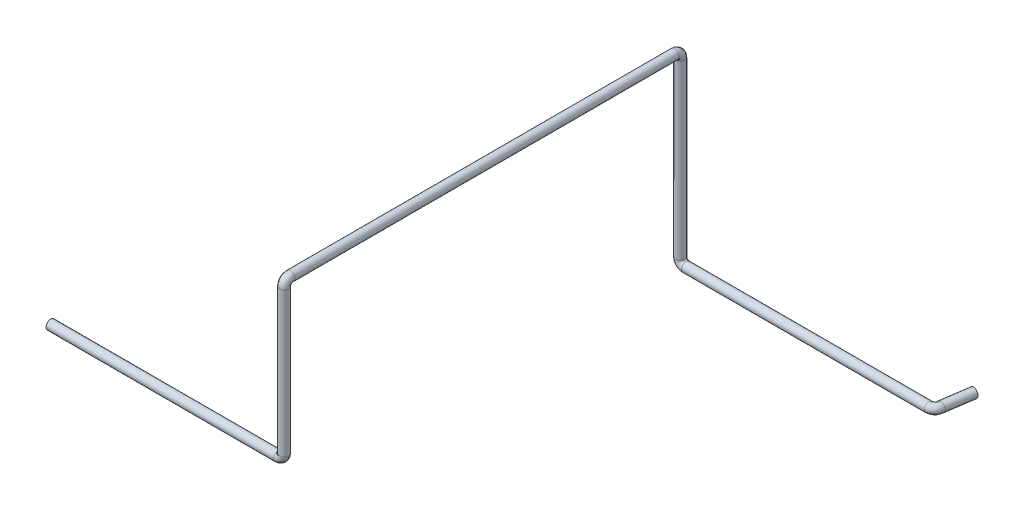
ISO-10303-21;
HEADER;
FILE_DESCRIPTION(('STEP AP214'),'2;1');
FILE_NAME('part.step','',(''),(''),'','','');
FILE_SCHEMA(('AUTOMOTIVE_DESIGN { 1 0 10303 214 1 1 1 1 }'));
ENDSEC;
DATA;
#1=APPLICATION_CONTEXT('core data for automotive mechanical design processes');
#2=APPLICATION_PROTOCOL_DEFINITION('international standard','automotive_design',2000,#1);
#3=PRODUCT_CONTEXT('',#1,'mechanical');
#4=PRODUCT('Part','Part','',(#3));
#5=PRODUCT_RELATED_PRODUCT_CATEGORY('part','',(#4));
#6=PRODUCT_DEFINITION_FORMATION('','',#4);
#7=PRODUCT_DEFINITION_CONTEXT('part definition',#1,'design');
#8=PRODUCT_DEFINITION('design','',#6,#7);
#9=PRODUCT_DEFINITION_SHAPE('','',#8);
#10=(LENGTH_UNIT() NAMED_UNIT(*) SI_UNIT(.MILLI.,.METRE.));
#11=(NAMED_UNIT(*) PLANE_ANGLE_UNIT() SI_UNIT($,.RADIAN.));
#12=(NAMED_UNIT(*) SI_UNIT($,.STERADIAN.) SOLID_ANGLE_UNIT());
#13=UNCERTAINTY_MEASURE_WITH_UNIT(LENGTH_MEASURE(1.E-05),#10,'distance_accuracy_value','');
#14=(GEOMETRIC_REPRESENTATION_CONTEXT(3) GLOBAL_UNCERTAINTY_ASSIGNED_CONTEXT((#13)) GLOBAL_UNIT_ASSIGNED_CONTEXT((#10,
#11,#12)) REPRESENTATION_CONTEXT('',''));
#15=CARTESIAN_POINT('',(0.,0.,0.));
#16=DIRECTION('',(0.,0.,1.));
#17=DIRECTION('',(1.,0.,0.));
#18=AXIS2_PLACEMENT_3D('',#15,#16,#17);
#19=CARTESIAN_POINT('',(41.0257932553289,-4.88008921079766,-67.9258668358255));
#20=DIRECTION('',(0.999999964203966,-0.00026756693960462,1.17513169097757E-12));
#21=DIRECTION('',(1.17481796432218E-12,-1.17267368564026E-12,-1.));
#22=AXIS2_PLACEMENT_3D('',#19,#20,#21);
#23=CIRCLE('',#22,0.793749999999996);
#24=DIRECTION('',(1.,0.,0.));
#25=VECTOR('',#24,1.);
#26=SURFACE_OF_LINEAR_EXTRUSION('',#23,#25);
#27=CARTESIAN_POINT('',(41.0255808740706,-5.67383918238455,-67.9258668358255));
#28=VERTEX_POINT('',#27);
#29=EDGE_CURVE('E62',#28,#28,#23,.T.);
#30=ORIENTED_EDGE('',*,*,#29,.T.);
#31=EDGE_LOOP('',(#30));
#32=FACE_BOUND('',#31,.T.);
#33=CARTESIAN_POINT('',(82.6707932553289,-4.88008921079766,-67.9258668358255));
#34=DIRECTION('',(0.999999964203966,-0.00026756693960462,1.17513169097757E-12));
#35=DIRECTION('',(1.17481796432218E-12,-1.17267368564026E-12,-1.));
#36=AXIS2_PLACEMENT_3D('',#33,#34,#35);
#37=CIRCLE('',#36,0.793749999999996);
#38=CARTESIAN_POINT('',(82.6707932553298,-4.88008921079859,-68.7196168358255));
#39=VERTEX_POINT('',#38);
#40=EDGE_CURVE('E11',#39,#39,#37,.T.);
#41=ORIENTED_EDGE('',*,*,#40,.F.);
#42=EDGE_LOOP('',(#41));
#43=FACE_BOUND('',#42,.T.);
#44=ADVANCED_FACE('F56',(#32,#43),#26,.T.);
#45=CARTESIAN_POINT('',(41.0260608222685,-3.88008924659369,-67.9258668358255));
#46=DIRECTION('',(-1.17267306976032E-12,0.,1.));
#47=DIRECTION('',(1.,0.,1.17267306976032E-12));
#48=AXIS2_PLACEMENT_3D('',#45,#46,#47);
#49=TOROIDAL_SURFACE('',#48,1.,0.793749999999996);
#50=CARTESIAN_POINT('',(40.0260608222685,-3.88008924659369,-67.9258668358267));
#51=DIRECTION('',(0.,-1.,0.));
#52=DIRECTION('',(0.,0.,-1.));
#53=AXIS2_PLACEMENT_3D('',#50,#51,#52);
#54=CIRCLE('',#53,0.793749999999996);
#55=CARTESIAN_POINT('',(39.2323108222685,-3.88008924659369,-67.9258668358276));
#56=VERTEX_POINT('',#55);
#57=EDGE_CURVE('E95',#56,#56,#54,.T.);
#58=CARTESIAN_POINT('',(41.0260608222685,-3.88008924659369,-67.9258668358255));
#59=DIRECTION('',(-1.17267306976032E-12,0.,1.));
#60=DIRECTION('',(1.,0.,1.17267306976032E-12));
#61=AXIS2_PLACEMENT_3D('',#58,#59,#60);
#62=CIRCLE('',#61,1.79375);
#63=EDGE_CURVE('',#56,#28,#62,.T.);
#64=ORIENTED_EDGE('',*,*,#57,.T.);
#65=ORIENTED_EDGE('',*,*,#29,.F.);
#66=ORIENTED_EDGE('',*,*,#63,.T.);
#67=ORIENTED_EDGE('',*,*,#63,.F.);
#68=EDGE_LOOP('',(#64,#66,#65,#67));
#69=FACE_BOUND('',#68,.T.);
#70=ADVANCED_FACE('F143',(#69),#49,.T.);
#71=CARTESIAN_POINT('',(39.03,0.,0.));
#72=DIRECTION('',(-1.,0.,0.));
#73=DIRECTION('',(0.,0.,1.));
#74=AXIS2_PLACEMENT_3D('',#71,#72,#73);
#75=CYLINDRICAL_SURFACE('',#74,0.793749999999999);
#76=CARTESIAN_POINT('',(39.03,0.,0.));
#77=DIRECTION('',(1.,0.,0.));
#78=DIRECTION('',(0.,0.,-1.));
#79=AXIS2_PLACEMENT_3D('',#76,#77,#78);
#80=CIRCLE('',#79,0.793749999999999);
#81=CARTESIAN_POINT('',(39.03,0.,-0.793749999999999));
#82=VERTEX_POINT('',#81);
#83=EDGE_CURVE('E66',#82,#82,#80,.T.);
#84=ORIENTED_EDGE('',*,*,#83,.F.);
#85=EDGE_LOOP('',(#84));
#86=FACE_BOUND('',#85,.T.);
#87=CARTESIAN_POINT('',(0.,0.,0.));
#88=DIRECTION('',(1.,0.,0.));
#89=DIRECTION('',(0.,0.,-1.));
#90=AXIS2_PLACEMENT_3D('',#87,#88,#89);
#91=CIRCLE('',#90,0.793749999999999);
#92=CARTESIAN_POINT('',(0.,0.,-0.793749999999999));
#93=VERTEX_POINT('',#92);
#94=EDGE_CURVE('E70',#93,#93,#91,.T.);
#95=ORIENTED_EDGE('',*,*,#94,.T.);
#96=EDGE_LOOP('',(#95));
#97=FACE_BOUND('',#96,.T.);
#98=ADVANCED_FACE('F147',(#86,#97),#75,.T.);
#99=CARTESIAN_POINT('',(0.,0.,0.));
#100=DIRECTION('',(1.,0.,0.));
#101=DIRECTION('',(0.,0.,-1.));
#102=AXIS2_PLACEMENT_3D('',#99,#100,#101);
#103=PLANE('',#102);
#104=ORIENTED_EDGE('',*,*,#94,.F.);
#105=EDGE_LOOP('',(#104));
#106=FACE_BOUND('',#105,.T.);
#107=ADVANCED_FACE('F153',(#106),#103,.F.);
#108=CARTESIAN_POINT('',(39.03,0.,-0.793749999999999));
#109=CARTESIAN_POINT('',(39.095279770204,0.,-0.793749999999999));
#110=CARTESIAN_POINT('',(39.2214878893359,0.0132172628994143,-0.793749999999999));
#111=CARTESIAN_POINT('',(39.4296616530544,0.0772373758963069,-0.793749999999999));
#112=CARTESIAN_POINT('',(39.6196732684097,0.183509851019233,-0.793749999999999));
#113=CARTESIAN_POINT('',(39.7735293441814,0.319747904994047,-0.793749999999999));
#114=CARTESIAN_POINT('',(39.9040212526352,0.500909275893127,-0.793749999999999));
#115=CARTESIAN_POINT('',(39.9937701763744,0.712330300778549,-0.79375));
#116=CARTESIAN_POINT('',(40.0199883978973,0.843115742960346,-0.793749999999999));
#117=CARTESIAN_POINT('',(40.026060822274,0.911327352972005,-0.793749999999999));
#118=CARTESIAN_POINT('',(39.03,1.5875,-0.793749999999999));
#119=CARTESIAN_POINT('',(39.095279770204,1.5875,-0.793749999999999));
#120=CARTESIAN_POINT('',(38.8338514776803,1.5761907982726,-0.793749999999999));
#121=CARTESIAN_POINT('',(38.7977475950457,1.53971736077892,-0.79375));
#122=CARTESIAN_POINT('',(38.6685541781513,1.47434908763942,-0.793749999999999));
#123=CARTESIAN_POINT('',(38.5539226471975,1.36242127183498,-0.793749999999999));
#124=CARTESIAN_POINT('',(38.4833703039127,1.22491108057854,-0.793749999999998));
#125=CARTESIAN_POINT('',(38.4516012684054,1.18681215509874,-0.793749999999998));
#126=CARTESIAN_POINT('',(38.4324883978973,0.913638557488902,-0.793749999999995));
#127=CARTESIAN_POINT('',(38.4385608222739,0.981850167500561,-0.793749999999995));
#128=CARTESIAN_POINT('',(39.03,1.5875,0.793749999999999));
#129=CARTESIAN_POINT('',(39.095279770204,1.5875,0.793749999999999));
#130=CARTESIAN_POINT('',(38.8338514776803,1.5761907982726,0.793749999999999));
#131=CARTESIAN_POINT('',(38.7977475950457,1.53971736077892,0.793749999999999));
#132=CARTESIAN_POINT('',(38.6685541781513,1.47434908763942,0.79375));
#133=CARTESIAN_POINT('',(38.5539226471975,1.36242127183498,0.79375));
#134=CARTESIAN_POINT('',(38.4833703039127,1.22491108057854,0.79375));
#135=CARTESIAN_POINT('',(38.4516012684054,1.18681215509874,0.793750000000001));
#136=CARTESIAN_POINT('',(38.4324883978973,0.913638557488902,0.793750000000003));
#137=CARTESIAN_POINT('',(38.4385608222739,0.981850167500561,0.793750000000003));
#138=CARTESIAN_POINT('',(39.03,0.,0.793749999999999));
#139=CARTESIAN_POINT('',(39.095279770204,0.,0.793749999999999));
#140=CARTESIAN_POINT('',(39.2214878893359,0.0132172628994142,0.793749999999999));
#141=CARTESIAN_POINT('',(39.4296616530544,0.0772373758963069,0.793749999999999));
#142=CARTESIAN_POINT('',(39.6196732684097,0.183509851019233,0.793749999999999));
#143=CARTESIAN_POINT('',(39.7735293441814,0.319747904994047,0.793749999999999));
#144=CARTESIAN_POINT('',(39.9040212526352,0.500909275893127,0.793749999999999));
#145=CARTESIAN_POINT('',(39.9937701763744,0.712330300778549,0.79375));
#146=CARTESIAN_POINT('',(40.0199883978973,0.843115742960346,0.793749999999999));
#147=CARTESIAN_POINT('',(40.026060822274,0.911327352972005,0.793749999999999));
#148=CARTESIAN_POINT('',(39.03,-1.5875,0.79375));
#149=CARTESIAN_POINT('',(39.095279770204,-1.5875,0.79375));
#150=CARTESIAN_POINT('',(39.6091243009916,-1.54975627247377,0.793749999999999));
#151=CARTESIAN_POINT('',(40.0615757110631,-1.38524260898631,0.79375));
#152=CARTESIAN_POINT('',(40.5707923586681,-1.10732938560096,0.793749999999998));
#153=CARTESIAN_POINT('',(40.9931360411654,-0.722925461846884,0.793749999999999));
#154=CARTESIAN_POINT('',(41.3246722013576,-0.223092528792273,0.793749999999999));
#155=CARTESIAN_POINT('',(41.5359390843435,0.237848446458355,0.793749999999998));
#156=CARTESIAN_POINT('',(41.6074883978973,0.77259292843179,0.793749999999995));
#157=CARTESIAN_POINT('',(41.613560822274,0.84080453844345,0.793749999999995));
#158=CARTESIAN_POINT('',(39.03,-1.5875,-0.793749999999999));
#159=CARTESIAN_POINT('',(39.095279770204,-1.5875,-0.793749999999999));
#160=CARTESIAN_POINT('',(39.6091243009916,-1.54975627247377,-0.793749999999999));
#161=CARTESIAN_POINT('',(40.0615757110631,-1.38524260898631,-0.793749999999999));
#162=CARTESIAN_POINT('',(40.5707923586681,-1.10732938560096,-0.79375));
#163=CARTESIAN_POINT('',(40.9931360411654,-0.722925461846884,-0.79375));
#164=CARTESIAN_POINT('',(41.3246722013576,-0.223092528792273,-0.79375));
#165=CARTESIAN_POINT('',(41.5359390843435,0.237848446458354,-0.793750000000001));
#166=CARTESIAN_POINT('',(41.6074883978973,0.77259292843179,-0.793750000000003));
#167=CARTESIAN_POINT('',(41.613560822274,0.84080453844345,-0.793750000000003));
#168=CARTESIAN_POINT('',(39.03,0.,-0.793749999999999));
#169=CARTESIAN_POINT('',(39.095279770204,0.,-0.793749999999999));
#170=CARTESIAN_POINT('',(39.2214878893359,0.0132172628994143,-0.793749999999999));
#171=CARTESIAN_POINT('',(39.4296616530544,0.0772373758963069,-0.793749999999999));
#172=CARTESIAN_POINT('',(39.6196732684097,0.183509851019233,-0.793749999999999));
#173=CARTESIAN_POINT('',(39.7735293441814,0.319747904994047,-0.793749999999999));
#174=CARTESIAN_POINT('',(39.9040212526352,0.500909275893127,-0.793749999999999));
#175=CARTESIAN_POINT('',(39.9937701763744,0.712330300778549,-0.79375));
#176=CARTESIAN_POINT('',(40.0199883978973,0.843115742960346,-0.793749999999999));
#177=CARTESIAN_POINT('',(40.026060822274,0.911327352972005,-0.793749999999999));
#178=(BOUNDED_SURFACE() B_SPLINE_SURFACE(3,3,((#108,#109,#110,#111,#112,#113,#114,#115,#116,
#117),(#118,#119,#120,#121,#122,#123,#124,#125,#126,#127),(#128,#129,#130,#131,#132,#133,#134,
#135,#136,#137),(#138,#139,#140,#141,#142,#143,#144,#145,#146,#147),(#148,#149,#150,#151,#152,
#153,#154,#155,#156,#157),(#158,#159,#160,#161,#162,#163,#164,#165,#166,#167),(#168,#169,#170,
#171,#172,#173,#174,#175,#176,#177)),.UNSPECIFIED.,.T.,.F.,.F.) B_SPLINE_SURFACE_WITH_KNOTS((4,
3,4),(4,1,1,1,1,1,1,4),(0.,0.5,1.),(0.,0.136322147353386,0.27127281533673,0.413325279073074,
0.565638666076834,0.715713661766469,0.857326161375633,1.),
.UNSPECIFIED.) GEOMETRIC_REPRESENTATION_ITEM() RATIONAL_B_SPLINE_SURFACE(((1.,1.,1.,1.,1.,1.,1.,
1.,1.,1.),(0.333333333333333,0.333333333333333,0.333333333333333,0.333333333333333,
0.333333333333333,0.333333333333333,0.333333333333333,0.333333333333333,0.333333333333333,
0.333333333333333),(0.333333333333333,0.333333333333333,0.333333333333333,0.333333333333333,
0.333333333333333,0.333333333333333,0.333333333333333,0.333333333333333,0.333333333333333,
0.333333333333333),(1.,1.,1.,1.,1.,1.,1.,1.,1.,1.),(0.333333333333333,0.333333333333333,
0.333333333333333,0.333333333333333,0.333333333333333,0.333333333333333,0.333333333333333,
0.333333333333333,0.333333333333333,0.333333333333333),(0.333333333333333,0.333333333333333,
0.333333333333333,0.333333333333333,0.333333333333333,0.333333333333333,0.333333333333333,
0.333333333333333,0.333333333333333,0.333333333333333),(1.,1.,1.,1.,1.,1.,1.,1.,1.,1.))) REPRESENTATION_ITEM('') SURFACE());
#179=CARTESIAN_POINT('',(40.026060822274,0.911327352972005,-0.793749999999999));
#180=CARTESIAN_POINT('',(41.613560822274,0.84080453844345,-0.793750000000003));
#181=CARTESIAN_POINT('',(41.613560822274,0.84080453844345,0.793749999999995));
#182=CARTESIAN_POINT('',(40.026060822274,0.911327352972005,0.793749999999999));
#183=CARTESIAN_POINT('',(38.4385608222739,0.981850167500561,0.793750000000003));
#184=CARTESIAN_POINT('',(38.4385608222739,0.981850167500561,-0.793749999999995));
#185=CARTESIAN_POINT('',(40.026060822274,0.911327352972005,-0.793749999999999));
#186=(BOUNDED_CURVE() B_SPLINE_CURVE(3,(#179,#180,#181,#182,#183,#184,#185),.UNSPECIFIED.,.T.,
.F.) B_SPLINE_CURVE_WITH_KNOTS((4,3,4),(0.,0.5,1.),
.UNSPECIFIED.) CURVE() GEOMETRIC_REPRESENTATION_ITEM() RATIONAL_B_SPLINE_CURVE((1.,
0.333333333333333,0.333333333333333,1.,0.333333333333333,0.333333333333333,1.)) REPRESENTATION_ITEM(''));
#187=CARTESIAN_POINT('',(40.026060822274,0.911327352972005,-0.793749999999999));
#188=VERTEX_POINT('',#187);
#189=EDGE_CURVE('E79',#188,#188,#186,.T.);
#190=ORIENTED_EDGE('',*,*,#83,.T.);
#191=EDGE_LOOP('',(#190));
#192=FACE_BOUND('',#191,.T.);
#193=ORIENTED_EDGE('',*,*,#189,.T.);
#194=EDGE_LOOP('',(#193));
#195=FACE_BOUND('',#194,.T.);
#196=ADVANCED_FACE('F160',(#192,#195),#178,.T.);
#197=CARTESIAN_POINT('',(40.026060822274,0.911327352972005,-0.793749999999999));
#198=CARTESIAN_POINT('',(40.026060822274,25.701327352972,-0.793750000000001));
#199=CARTESIAN_POINT('',(41.613560822274,0.84080453844345,-0.793750000000003));
#200=CARTESIAN_POINT('',(41.613560822274,25.701327352972,-0.793750000000005));
#201=CARTESIAN_POINT('',(41.613560822274,0.84080453844345,0.793749999999995));
#202=CARTESIAN_POINT('',(41.613560822274,25.701327352972,0.793749999999994));
#203=CARTESIAN_POINT('',(40.026060822274,0.911327352972005,0.793749999999999));
#204=CARTESIAN_POINT('',(40.026060822274,25.701327352972,0.793749999999998));
#205=CARTESIAN_POINT('',(38.4385608222739,0.981850167500561,0.793750000000003));
#206=CARTESIAN_POINT('',(38.4385608222739,25.701327352972,0.793750000000002));
#207=CARTESIAN_POINT('',(38.4385608222739,0.981850167500561,-0.793749999999995));
#208=CARTESIAN_POINT('',(38.4385608222739,25.701327352972,-0.793749999999996));
#209=CARTESIAN_POINT('',(40.026060822274,0.911327352972005,-0.793749999999999));
#210=CARTESIAN_POINT('',(40.026060822274,25.701327352972,-0.793750000000001));
#211=(BOUNDED_SURFACE() B_SPLINE_SURFACE(3,1,((#197,#198),(#199,#200),(#201,#202),(#203,#204),
(#205,#206),(#207,#208),(#209,#210)),.UNSPECIFIED.,.T.,.F.,.F.) B_SPLINE_SURFACE_WITH_KNOTS((4,
3,4),(2,2),(0.,0.5,1.),(0.,1.),
.UNSPECIFIED.) GEOMETRIC_REPRESENTATION_ITEM() RATIONAL_B_SPLINE_SURFACE(((1.,1.),
(0.333333333333333,0.333333333333333),(0.333333333333333,0.333333333333333),(1.,1.),
(0.333333333333333,0.333333333333333),(0.333333333333333,0.333333333333333),(1.,1.))) REPRESENTATION_ITEM('') SURFACE());
#212=CARTESIAN_POINT('',(40.026060822274,25.701327352972,0.));
#213=DIRECTION('',(0.,1.,0.));
#214=DIRECTION('',(0.,0.,1.));
#215=AXIS2_PLACEMENT_3D('',#212,#213,#214);
#216=CIRCLE('',#215,0.793749999999999);
#217=CARTESIAN_POINT('',(40.026060822274,25.701327352972,0.793749999999998));
#218=VERTEX_POINT('',#217);
#219=EDGE_CURVE('E75',#218,#218,#216,.T.);
#220=ORIENTED_EDGE('',*,*,#189,.F.);
#221=EDGE_LOOP('',(#220));
#222=FACE_BOUND('',#221,.T.);
#223=ORIENTED_EDGE('',*,*,#219,.F.);
#224=EDGE_LOOP('',(#223));
#225=FACE_BOUND('',#224,.T.);
#226=ADVANCED_FACE('F166',(#222,#225),#211,.F.);
#227=CARTESIAN_POINT('',(40.026060822274,25.701327352972,0.793749999999998));
#228=CARTESIAN_POINT('',(40.026060822274,25.8076968415257,0.787565476840173));
#229=CARTESIAN_POINT('',(40.026060822274,26.0255031925969,0.774901803818216));
#230=CARTESIAN_POINT('',(40.0260608222736,26.3274965330698,0.686371597663777));
#231=CARTESIAN_POINT('',(40.0260608222728,26.6240303645177,0.5476511649102));
#232=CARTESIAN_POINT('',(40.0260608222722,26.9050227541166,0.346063573010823));
#233=CARTESIAN_POINT('',(40.02606082227,27.148764805011,0.079131490988676));
#234=CARTESIAN_POINT('',(40.0260608222692,27.3219816977915,-0.214444764510279));
#235=CARTESIAN_POINT('',(40.0260608222675,27.4334387742604,-0.513056668087916));
#236=CARTESIAN_POINT('',(40.0260608222659,27.4949375211034,-0.821868648298212));
#237=CARTESIAN_POINT('',(40.026060822265,27.4930834565994,-1.01358868332669));
#238=CARTESIAN_POINT('',(40.0260608222645,27.4921883452422,-1.10614791218774));
#239=CARTESIAN_POINT('',(41.613560822274,25.701327352972,0.793749999999998));
#240=CARTESIAN_POINT('',(41.613560822274,25.8076968415262,0.787565476840063));
#241=CARTESIAN_POINT('',(41.613560822274,26.0255031925984,0.774901803817878));
#242=CARTESIAN_POINT('',(41.6135608222736,26.3274965330724,0.686371597663018));
#243=CARTESIAN_POINT('',(41.6135608222728,26.6240303645217,0.547651164908936));
#244=CARTESIAN_POINT('',(41.6135608222722,26.9050227541214,0.346063573008009));
#245=CARTESIAN_POINT('',(41.6135608222701,27.148764805018,0.0791314909857428));
#246=CARTESIAN_POINT('',(41.6135608222692,27.3219816977982,-0.214444764515208));
#247=CARTESIAN_POINT('',(41.6135608222675,27.433438774268,-0.513056668093451));
#248=CARTESIAN_POINT('',(41.6135608222659,27.4949375211111,-0.821868648306655));
#249=CARTESIAN_POINT('',(41.613560822265,27.4930834566072,-1.01358868333235));
#250=CARTESIAN_POINT('',(41.6135608222645,27.4921883452501,-1.10614791219206));
#251=CARTESIAN_POINT('',(41.613560822274,25.701327352972,-0.79375));
#252=CARTESIAN_POINT('',(41.6135608222739,25.7083768680762,-0.794079149165104));
#253=CARTESIAN_POINT('',(41.6135608222738,25.7228117326464,-0.79475312794966));
#254=CARTESIAN_POINT('',(41.6135608222737,25.7712495239733,-0.807470808348524));
#255=CARTESIAN_POINT('',(41.6135608222737,25.8151654631321,-0.828716998443231));
#256=CARTESIAN_POINT('',(41.6135608222732,25.8467662363154,-0.852628124859535));
#257=CARTESIAN_POINT('',(41.6135608222738,25.8604152577841,-0.86784739433145));
#258=CARTESIAN_POINT('',(41.6135608222731,25.8819720353341,-0.90116208318566));
#259=CARTESIAN_POINT('',(41.613560822273,25.89885297539,-0.949219374129986));
#260=CARTESIAN_POINT('',(41.6135608222728,25.9082340209786,-0.985619348304292));
#261=CARTESIAN_POINT('',(41.6135608222726,25.9058427910818,-1.02618455818453));
#262=CARTESIAN_POINT('',(41.6135608222725,25.9046883452501,-1.04576876358353));
#263=CARTESIAN_POINT('',(40.026060822274,25.701327352972,-0.793750000000001));
#264=CARTESIAN_POINT('',(40.0260608222739,25.7083768680757,-0.794079149164993));
#265=CARTESIAN_POINT('',(40.0260608222738,25.7228117326449,-0.794753127949322));
#266=CARTESIAN_POINT('',(40.0260608222737,25.7712495239707,-0.807470808347766));
#267=CARTESIAN_POINT('',(40.0260608222737,25.8151654631281,-0.82871699844197));
#268=CARTESIAN_POINT('',(40.0260608222731,25.8467662363106,-0.852628124856719));
#269=CARTESIAN_POINT('',(40.0260608222738,25.8604152577771,-0.867847394328516));
#270=CARTESIAN_POINT('',(40.0260608222731,25.8819720353275,-0.901162083180735));
#271=CARTESIAN_POINT('',(40.026060822273,25.8988529753825,-0.949219374124447));
#272=CARTESIAN_POINT('',(40.0260608222728,25.9082340209709,-0.985619348295844));
#273=CARTESIAN_POINT('',(40.0260608222726,25.9058427910739,-1.02618455817886));
#274=CARTESIAN_POINT('',(40.0260608222725,25.9046883452422,-1.04576876357921));
#275=CARTESIAN_POINT('',(38.438560822274,25.701327352972,-0.793750000000001));
#276=CARTESIAN_POINT('',(38.4385608222739,25.7083768680752,-0.794079149164883));
#277=CARTESIAN_POINT('',(38.4385608222738,25.7228117326434,-0.794753127948987));
#278=CARTESIAN_POINT('',(38.4385608222737,25.771249523968,-0.807470808347007));
#279=CARTESIAN_POINT('',(38.4385608222737,25.8151654631242,-0.828716998440717));
#280=CARTESIAN_POINT('',(38.4385608222731,25.8467662363059,-0.852628124853906));
#281=CARTESIAN_POINT('',(38.4385608222738,25.8604152577701,-0.867847394325573));
#282=CARTESIAN_POINT('',(38.4385608222731,25.8819720353209,-0.901162083175815));
#283=CARTESIAN_POINT('',(38.438560822273,25.898852975375,-0.949219374118929));
#284=CARTESIAN_POINT('',(38.4385608222728,25.9082340209633,-0.985619348287397));
#285=CARTESIAN_POINT('',(38.4385608222726,25.905842791066,-1.0261845581732));
#286=CARTESIAN_POINT('',(38.4385608222725,25.9046883452342,-1.04576876357489));
#287=CARTESIAN_POINT('',(38.438560822274,25.701327352972,0.793749999999998));
#288=CARTESIAN_POINT('',(38.438560822274,25.8076968415252,0.787565476840284));
#289=CARTESIAN_POINT('',(38.438560822274,26.0255031925954,0.774901803818553));
#290=CARTESIAN_POINT('',(38.4385608222736,26.3274965330672,0.686371597664535));
#291=CARTESIAN_POINT('',(38.4385608222728,26.6240303645137,0.54765116491145));
#292=CARTESIAN_POINT('',(38.4385608222722,26.905022754112,0.346063573013639));
#293=CARTESIAN_POINT('',(38.4385608222701,27.148764805004,0.0791314909916198));
#294=CARTESIAN_POINT('',(38.4385608222692,27.3219816977849,-0.214444764505364));
#295=CARTESIAN_POINT('',(38.4385608222675,27.4334387742529,-0.513056668082394));
#296=CARTESIAN_POINT('',(38.4385608222659,27.4949375210958,-0.82186864828976));
#297=CARTESIAN_POINT('',(38.438560822265,27.4930834565915,-1.01358868332102));
#298=CARTESIAN_POINT('',(38.4385608222645,27.4921883452342,-1.10614791218342));
#299=CARTESIAN_POINT('',(40.026060822274,25.701327352972,0.793749999999998));
#300=CARTESIAN_POINT('',(40.026060822274,25.8076968415257,0.787565476840173));
#301=CARTESIAN_POINT('',(40.026060822274,26.0255031925969,0.774901803818216));
#302=CARTESIAN_POINT('',(40.0260608222736,26.3274965330698,0.686371597663777));
#303=CARTESIAN_POINT('',(40.0260608222728,26.6240303645177,0.5476511649102));
#304=CARTESIAN_POINT('',(40.0260608222722,26.9050227541166,0.346063573010823));
#305=CARTESIAN_POINT('',(40.02606082227,27.148764805011,0.079131490988676));
#306=CARTESIAN_POINT('',(40.0260608222692,27.3219816977915,-0.214444764510279));
#307=CARTESIAN_POINT('',(40.0260608222675,27.4334387742604,-0.513056668087916));
#308=CARTESIAN_POINT('',(40.0260608222659,27.4949375211034,-0.821868648298212));
#309=CARTESIAN_POINT('',(40.026060822265,27.4930834565994,-1.01358868332669));
#310=CARTESIAN_POINT('',(40.0260608222645,27.4921883452422,-1.10614791218774));
#311=(BOUNDED_SURFACE() B_SPLINE_SURFACE(3,3,((#227,#228,#229,#230,#231,#232,#233,#234,#235,
#236,#237,#238),(#239,#240,#241,#242,#243,#244,#245,#246,#247,#248,#249,#250),(#251,#252,#253,
#254,#255,#256,#257,#258,#259,#260,#261,#262),(#263,#264,#265,#266,#267,#268,#269,#270,#271,
#272,#273,#274),(#275,#276,#277,#278,#279,#280,#281,#282,#283,#284,#285,#286),(#287,#288,#289,
#290,#291,#292,#293,#294,#295,#296,#297,#298),(#299,#300,#301,#302,#303,#304,#305,#306,#307,
#308,#309,#310)),.UNSPECIFIED.,.T.,.F.,.F.) B_SPLINE_SURFACE_WITH_KNOTS((4,3,4),(4,1,1,1,1,1,1,
1,1,4),(0.,0.5,1.),(0.,0.104835867011032,0.214666047242785,0.328486040425943,0.445624748974206,
0.565169243996305,0.680023187442256,0.791660763017614,0.899417298177912,1.),
.UNSPECIFIED.) GEOMETRIC_REPRESENTATION_ITEM() RATIONAL_B_SPLINE_SURFACE(((1.,1.,1.,1.,1.,1.,1.,
0.999999999999999,1.,1.,1.,1.),(0.333333333333333,0.333333333333333,0.333333333333333,
0.333333333333333,0.333333333333333,0.333333333333333,0.333333333333333,0.333333333333333,
0.333333333333334,0.333333333333333,0.333333333333333,0.333333333333333),(0.333333333333333,
0.333333333333333,0.333333333333333,0.333333333333333,0.333333333333333,0.333333333333333,
0.333333333333333,0.333333333333333,0.333333333333334,0.333333333333333,0.333333333333333,
0.333333333333333),(1.,1.,1.,1.,1.,1.,1.,0.999999999999999,1.,1.,1.,1.),(0.333333333333333,
0.333333333333333,0.333333333333333,0.333333333333333,0.333333333333333,0.333333333333333,
0.333333333333333,0.333333333333333,0.333333333333334,0.333333333333333,0.333333333333333,
0.333333333333333),(0.333333333333333,0.333333333333333,0.333333333333333,0.333333333333333,
0.333333333333333,0.333333333333333,0.333333333333333,0.333333333333333,0.333333333333334,
0.333333333333333,0.333333333333333,0.333333333333333),(1.,1.,1.,1.,1.,1.,1.,0.999999999999999,
1.,1.,1.,1.))) REPRESENTATION_ITEM('') SURFACE());
#312=CARTESIAN_POINT('',(40.0260608222645,27.4921883452422,-1.10614791218774));
#313=CARTESIAN_POINT('',(38.4385608222645,27.4921883452342,-1.10614791218342));
#314=CARTESIAN_POINT('',(38.4385608222725,25.9046883452342,-1.04576876357489));
#315=CARTESIAN_POINT('',(40.0260608222725,25.9046883452422,-1.04576876357921));
#316=CARTESIAN_POINT('',(41.6135608222725,25.9046883452501,-1.04576876358353));
#317=CARTESIAN_POINT('',(41.6135608222645,27.4921883452501,-1.10614791219206));
#318=CARTESIAN_POINT('',(40.0260608222645,27.4921883452422,-1.10614791218774));
#319=(BOUNDED_CURVE() B_SPLINE_CURVE(3,(#312,#313,#314,#315,#316,#317,#318),.UNSPECIFIED.,.T.,
.F.) B_SPLINE_CURVE_WITH_KNOTS((4,3,4),(0.,0.5,1.),
.UNSPECIFIED.) CURVE() GEOMETRIC_REPRESENTATION_ITEM() RATIONAL_B_SPLINE_CURVE((1.,
0.333333333333333,0.333333333333333,1.,0.333333333333333,0.333333333333333,1.)) REPRESENTATION_ITEM(''));
#320=CARTESIAN_POINT('',(40.0260608222645,27.4921883452422,-1.10614791218774));
#321=VERTEX_POINT('',#320);
#322=EDGE_CURVE('E90',#321,#321,#319,.T.);
#323=ORIENTED_EDGE('',*,*,#219,.T.);
#324=EDGE_LOOP('',(#323));
#325=FACE_BOUND('',#324,.T.);
#326=ORIENTED_EDGE('',*,*,#322,.T.);
#327=EDGE_LOOP('',(#326));
#328=FACE_BOUND('',#327,.T.);
#329=ADVANCED_FACE('F177',(#325,#328),#311,.T.);
#330=CARTESIAN_POINT('',(40.0260608222645,27.4921883452422,-1.10614791218774));
#331=CARTESIAN_POINT('',(40.0260608222645,27.4921883452422,-66.9259583378835));
#332=CARTESIAN_POINT('',(38.4385608222645,27.4921883452342,-1.10614791218342));
#333=CARTESIAN_POINT('',(38.4385608222645,27.4921883452342,-66.9259583378835));
#334=CARTESIAN_POINT('',(38.4385608222725,25.9046883452342,-1.04576876357489));
#335=CARTESIAN_POINT('',(38.4385608222725,25.9046883452342,-66.9259583378835));
#336=CARTESIAN_POINT('',(40.0260608222725,25.9046883452422,-1.04576876357921));
#337=CARTESIAN_POINT('',(40.0260608222725,25.9046883452422,-66.9259583378835));
#338=CARTESIAN_POINT('',(41.6135608222725,25.9046883452501,-1.04576876358353));
#339=CARTESIAN_POINT('',(41.6135608222725,25.9046883452501,-66.9259583378835));
#340=CARTESIAN_POINT('',(41.6135608222645,27.4921883452501,-1.10614791219206));
#341=CARTESIAN_POINT('',(41.6135608222645,27.4921883452501,-66.9259583378835));
#342=CARTESIAN_POINT('',(40.0260608222645,27.4921883452422,-1.10614791218774));
#343=CARTESIAN_POINT('',(40.0260608222645,27.4921883452422,-66.9259583378835));
#344=(BOUNDED_SURFACE() B_SPLINE_SURFACE(3,1,((#330,#331),(#332,#333),(#334,#335),(#336,#337),
(#338,#339),(#340,#341),(#342,#343)),.UNSPECIFIED.,.T.,.F.,.F.) B_SPLINE_SURFACE_WITH_KNOTS((4,
3,4),(2,2),(0.,0.5,1.),(0.,1.),
.UNSPECIFIED.) GEOMETRIC_REPRESENTATION_ITEM() RATIONAL_B_SPLINE_SURFACE(((1.,1.),
(0.333333333333333,0.333333333333333),(0.333333333333333,0.333333333333333),(1.,1.),
(0.333333333333333,0.333333333333333),(0.333333333333333,0.333333333333333),(1.,1.))) REPRESENTATION_ITEM('') SURFACE());
#345=CARTESIAN_POINT('',(40.0260608222685,26.6984383452422,-66.9259583378835));
#346=DIRECTION('',(0.,0.,-1.));
#347=DIRECTION('',(-1.,0.,0.));
#348=AXIS2_PLACEMENT_3D('',#345,#346,#347);
#349=CIRCLE('',#348,0.793749999999999);
#350=CARTESIAN_POINT('',(39.2323108222685,26.6984383452422,-66.9259583378835));
#351=VERTEX_POINT('',#350);
#352=EDGE_CURVE('E84',#351,#351,#349,.T.);
#353=ORIENTED_EDGE('',*,*,#322,.F.);
#354=EDGE_LOOP('',(#353));
#355=FACE_BOUND('',#354,.T.);
#356=ORIENTED_EDGE('',*,*,#352,.F.);
#357=EDGE_LOOP('',(#356));
#358=FACE_BOUND('',#357,.T.);
#359=ADVANCED_FACE('F188',(#355,#358),#344,.F.);
#360=CARTESIAN_POINT('',(39.2323108222685,26.6984383452422,-66.9259583378835));
#361=CARTESIAN_POINT('',(39.2323108222685,26.6941104174008,-66.9938724066275));
#362=CARTESIAN_POINT('',(39.2323108222685,26.6855034510994,-67.1289333694024));
#363=CARTESIAN_POINT('',(39.2323108222685,26.6097869498469,-67.3510366587675));
#364=CARTESIAN_POINT('',(39.2323108222685,26.4895458337174,-67.5512135552354));
#365=CARTESIAN_POINT('',(39.2323108222685,26.3483381558508,-67.6952581659101));
#366=CARTESIAN_POINT('',(39.2323108222685,26.1818900135586,-67.8051720565903));
#367=CARTESIAN_POINT('',(39.2323108222685,26.0152944306286,-67.8764989503127));
#368=CARTESIAN_POINT('',(39.2323108222685,25.8453228433184,-67.9197169074432));
#369=CARTESIAN_POINT('',(39.2323108222685,25.7383089793747,-67.9238196381019));
#370=CARTESIAN_POINT('',(39.2323108222685,25.6849107534063,-67.9258668358269));
#371=CARTESIAN_POINT('',(39.2323108222685,28.2859383452422,-66.9259583378835));
#372=CARTESIAN_POINT('',(39.2323108222685,28.2739578155792,-67.1103183105004));
#373=CARTESIAN_POINT('',(39.2323108222686,28.2501320913844,-67.4769556782694));
#374=CARTESIAN_POINT('',(39.2323108222689,28.0627115112161,-68.017275098093));
#375=CARTESIAN_POINT('',(39.2323108222689,27.7614304383101,-68.5269702035158));
#376=CARTESIAN_POINT('',(39.2323108222689,27.3678165952978,-68.9284780590591));
#377=CARTESIAN_POINT('',(39.2323108222689,26.9366199195457,-69.2109139252548));
#378=CARTESIAN_POINT('',(39.2323108222689,26.5235442390484,-69.3873513457065));
#379=CARTESIAN_POINT('',(39.2323108222689,26.1007877690214,-69.4958424228955));
#380=CARTESIAN_POINT('',(39.2323108222689,25.8161850117529,-69.5075332819957));
#381=CARTESIAN_POINT('',(39.2323108222689,25.6741727361113,-69.5133668358269));
#382=CARTESIAN_POINT('',(40.8198108222685,28.2859383452422,-66.9259583378835));
#383=CARTESIAN_POINT('',(40.8198108222685,28.2739578155791,-67.1103183105004));
#384=CARTESIAN_POINT('',(40.8198108222686,28.2501320913843,-67.4769556782693));
#385=CARTESIAN_POINT('',(40.8198108222689,28.0627115112157,-68.0172750980928));
#386=CARTESIAN_POINT('',(40.8198108222688,27.7614304383098,-68.5269702035155));
#387=CARTESIAN_POINT('',(40.8198108222689,27.3678165952976,-68.9284780590587));
#388=CARTESIAN_POINT('',(40.8198108222689,26.9366199195456,-69.2109139252545));
#389=CARTESIAN_POINT('',(40.8198108222689,26.5235442390483,-69.3873513457062));
#390=CARTESIAN_POINT('',(40.8198108222689,26.1007877690214,-69.4958424228952));
#391=CARTESIAN_POINT('',(40.8198108222689,25.8161850117529,-69.5075332819954));
#392=CARTESIAN_POINT('',(40.8198108222689,25.6741727361113,-69.5133668358265));
#393=CARTESIAN_POINT('',(40.8198108222685,26.6984383452422,-66.9259583378835));
#394=CARTESIAN_POINT('',(40.8198108222685,26.6941104174008,-66.9938724066274));
#395=CARTESIAN_POINT('',(40.8198108222685,26.6855034510993,-67.1289333694023));
#396=CARTESIAN_POINT('',(40.8198108222685,26.6097869498466,-67.3510366587673));
#397=CARTESIAN_POINT('',(40.8198108222685,26.4895458337171,-67.5512135552352));
#398=CARTESIAN_POINT('',(40.8198108222685,26.3483381558506,-67.6952581659097));
#399=CARTESIAN_POINT('',(40.8198108222685,26.1818900135585,-67.80517205659));
#400=CARTESIAN_POINT('',(40.8198108222685,26.0152944306286,-67.8764989503124));
#401=CARTESIAN_POINT('',(40.8198108222685,25.8453228433184,-67.9197169074428));
#402=CARTESIAN_POINT('',(40.8198108222685,25.7383089793747,-67.9238196381016));
#403=CARTESIAN_POINT('',(40.8198108222685,25.6849107534063,-67.9258668358265));
#404=CARTESIAN_POINT('',(40.8198108222685,25.1109383452422,-66.9259583378835));
#405=CARTESIAN_POINT('',(40.8198108222685,25.1142630192224,-66.8774265027545));
#406=CARTESIAN_POINT('',(40.8198108222684,25.1208748108142,-66.7809110605353));
#407=CARTESIAN_POINT('',(40.8198108222681,25.1568623884775,-66.684798219442));
#408=CARTESIAN_POINT('',(40.8198108222682,25.2176612291245,-66.5754569069548));
#409=CARTESIAN_POINT('',(40.8198108222681,25.3288597164036,-66.4620382727608));
#410=CARTESIAN_POINT('',(40.8198108222682,25.4271601075713,-66.3994301879256));
#411=CARTESIAN_POINT('',(40.8198108222681,25.5070446222088,-66.3656465549186));
#412=CARTESIAN_POINT('',(40.8198108222682,25.5898579176154,-66.3435913919905));
#413=CARTESIAN_POINT('',(40.8198108222682,25.6604329469965,-66.3401059942078));
#414=CARTESIAN_POINT('',(40.8198108222682,25.6956487707014,-66.3383668358265));
#415=CARTESIAN_POINT('',(39.2323108222685,25.1109383452422,-66.9259583378835));
#416=CARTESIAN_POINT('',(39.2323108222685,25.1142630192225,-66.8774265027546));
#417=CARTESIAN_POINT('',(39.2323108222684,25.1208748108143,-66.7809110605353));
#418=CARTESIAN_POINT('',(39.2323108222681,25.1568623884778,-66.6847982194422));
#419=CARTESIAN_POINT('',(39.2323108222682,25.2176612291247,-66.575456906955));
#420=CARTESIAN_POINT('',(39.2323108222682,25.3288597164038,-66.462038272761));
#421=CARTESIAN_POINT('',(39.2323108222682,25.4271601075715,-66.3994301879259));
#422=CARTESIAN_POINT('',(39.2323108222681,25.5070446222088,-66.3656465549189));
#423=CARTESIAN_POINT('',(39.2323108222682,25.5898579176154,-66.3435913919909));
#424=CARTESIAN_POINT('',(39.2323108222682,25.6604329469965,-66.3401059942082));
#425=CARTESIAN_POINT('',(39.2323108222682,25.6956487707014,-66.3383668358269));
#426=CARTESIAN_POINT('',(39.2323108222685,26.6984383452422,-66.9259583378835));
#427=CARTESIAN_POINT('',(39.2323108222685,26.6941104174008,-66.9938724066275));
#428=CARTESIAN_POINT('',(39.2323108222685,26.6855034510994,-67.1289333694024));
#429=CARTESIAN_POINT('',(39.2323108222685,26.6097869498469,-67.3510366587675));
#430=CARTESIAN_POINT('',(39.2323108222685,26.4895458337174,-67.5512135552354));
#431=CARTESIAN_POINT('',(39.2323108222685,26.3483381558508,-67.6952581659101));
#432=CARTESIAN_POINT('',(39.2323108222685,26.1818900135586,-67.8051720565903));
#433=CARTESIAN_POINT('',(39.2323108222685,26.0152944306286,-67.8764989503127));
#434=CARTESIAN_POINT('',(39.2323108222685,25.8453228433184,-67.9197169074432));
#435=CARTESIAN_POINT('',(39.2323108222685,25.7383089793747,-67.9238196381019));
#436=CARTESIAN_POINT('',(39.2323108222685,25.6849107534063,-67.9258668358269));
#437=(BOUNDED_SURFACE() B_SPLINE_SURFACE(3,3,((#360,#361,#362,#363,#364,#365,#366,#367,#368,
#369,#370),(#371,#372,#373,#374,#375,#376,#377,#378,#379,#380,#381),(#382,#383,#384,#385,#386,
#387,#388,#389,#390,#391,#392),(#393,#394,#395,#396,#397,#398,#399,#400,#401,#402,#403),(#404,
#405,#406,#407,#408,#409,#410,#411,#412,#413,#414),(#415,#416,#417,#418,#419,#420,#421,#422,
#423,#424,#425),(#426,#427,#428,#429,#430,#431,#432,#433,#434,#435,#436)),.UNSPECIFIED.,.T.,.F.,
.F.) B_SPLINE_SURFACE_WITH_KNOTS((4,3,4),(4,1,1,1,1,1,1,1,4),(0.,0.5,1.),(0.,0.136041079754621,
0.270545404632527,0.413319569603802,0.567755770994871,0.682495739116729,0.790366550166599,
0.895396223328364,1.),
.UNSPECIFIED.) GEOMETRIC_REPRESENTATION_ITEM() RATIONAL_B_SPLINE_SURFACE(((1.,1.,1.,1.,1.,1.,1.,
1.,1.,1.,1.),(0.333333333333333,0.333333333333333,0.333333333333333,0.333333333333333,
0.333333333333333,0.333333333333333,0.333333333333333,0.333333333333333,0.333333333333333,
0.333333333333333,0.333333333333333),(0.333333333333333,0.333333333333333,0.333333333333333,
0.333333333333333,0.333333333333333,0.333333333333333,0.333333333333333,0.333333333333333,
0.333333333333333,0.333333333333333,0.333333333333333),(1.,1.,1.,1.,1.,1.,1.,1.,1.,1.,1.),
(0.333333333333333,0.333333333333333,0.333333333333333,0.333333333333333,0.333333333333333,
0.333333333333333,0.333333333333333,0.333333333333333,0.333333333333333,0.333333333333333,
0.333333333333333),(0.333333333333333,0.333333333333333,0.333333333333333,0.333333333333333,
0.333333333333333,0.333333333333333,0.333333333333333,0.333333333333333,0.333333333333333,
0.333333333333333,0.333333333333333),(1.,1.,1.,1.,1.,1.,1.,1.,1.,1.,1.))) REPRESENTATION_ITEM('') SURFACE());
#438=CARTESIAN_POINT('',(39.2323108222685,25.6849107534063,-67.9258668358269));
#439=CARTESIAN_POINT('',(39.2323108222682,25.6956487707014,-66.3383668358269));
#440=CARTESIAN_POINT('',(40.8198108222682,25.6956487707014,-66.3383668358265));
#441=CARTESIAN_POINT('',(40.8198108222685,25.6849107534063,-67.9258668358265));
#442=CARTESIAN_POINT('',(40.8198108222689,25.6741727361113,-69.5133668358265));
#443=CARTESIAN_POINT('',(39.2323108222689,25.6741727361113,-69.5133668358269));
#444=CARTESIAN_POINT('',(39.2323108222685,25.6849107534063,-67.9258668358269));
#445=(BOUNDED_CURVE() B_SPLINE_CURVE(3,(#438,#439,#440,#441,#442,#443,#444),.UNSPECIFIED.,.T.,
.F.) B_SPLINE_CURVE_WITH_KNOTS((4,3,4),(0.,0.5,1.),
.UNSPECIFIED.) CURVE() GEOMETRIC_REPRESENTATION_ITEM() RATIONAL_B_SPLINE_CURVE((1.,
0.333333333333333,0.333333333333333,1.,0.333333333333333,0.333333333333333,1.)) REPRESENTATION_ITEM(''));
#446=CARTESIAN_POINT('',(39.2323108222685,25.6849107534063,-67.9258668358269));
#447=VERTEX_POINT('',#446);
#448=EDGE_CURVE('E101',#447,#447,#445,.T.);
#449=ORIENTED_EDGE('',*,*,#352,.T.);
#450=EDGE_LOOP('',(#449));
#451=FACE_BOUND('',#450,.T.);
#452=ORIENTED_EDGE('',*,*,#448,.T.);
#453=EDGE_LOOP('',(#452));
#454=FACE_BOUND('',#453,.T.);
#455=ADVANCED_FACE('F199',(#451,#454),#437,.T.);
#456=CARTESIAN_POINT('',(39.2323108222685,25.6849107534063,-67.9258668358269));
#457=CARTESIAN_POINT('',(39.2323108222685,-3.88008924659369,-67.9258668358269));
#458=CARTESIAN_POINT('',(39.2323108222682,25.6956487707014,-66.3383668358269));
#459=CARTESIAN_POINT('',(39.2323108222682,-3.88008924659369,-66.3383668358269));
#460=CARTESIAN_POINT('',(40.8198108222682,25.6956487707014,-66.3383668358265));
#461=CARTESIAN_POINT('',(40.8198108222682,-3.88008924659369,-66.3383668358265));
#462=CARTESIAN_POINT('',(40.8198108222685,25.6849107534063,-67.9258668358265));
#463=CARTESIAN_POINT('',(40.8198108222685,-3.88008924659369,-67.9258668358265));
#464=CARTESIAN_POINT('',(40.8198108222689,25.6741727361113,-69.5133668358265));
#465=CARTESIAN_POINT('',(40.8198108222689,-3.88008924659369,-69.5133668358265));
#466=CARTESIAN_POINT('',(39.2323108222689,25.6741727361113,-69.5133668358269));
#467=CARTESIAN_POINT('',(39.2323108222689,-3.88008924659369,-69.5133668358269));
#468=CARTESIAN_POINT('',(39.2323108222685,25.6849107534063,-67.9258668358269));
#469=CARTESIAN_POINT('',(39.2323108222685,-3.88008924659369,-67.9258668358269));
#470=(BOUNDED_SURFACE() B_SPLINE_SURFACE(3,1,((#456,#457),(#458,#459),(#460,#461),(#462,#463),
(#464,#465),(#466,#467),(#468,#469)),.UNSPECIFIED.,.T.,.F.,.F.) B_SPLINE_SURFACE_WITH_KNOTS((4,
3,4),(2,2),(0.,0.5,1.),(0.,1.),
.UNSPECIFIED.) GEOMETRIC_REPRESENTATION_ITEM() RATIONAL_B_SPLINE_SURFACE(((1.,1.),
(0.333333333333333,0.333333333333333),(0.333333333333333,0.333333333333333),(1.,1.),
(0.333333333333333,0.333333333333333),(0.333333333333333,0.333333333333333),(1.,1.))) REPRESENTATION_ITEM('') SURFACE());
#471=ORIENTED_EDGE('',*,*,#448,.F.);
#472=EDGE_LOOP('',(#471));
#473=FACE_BOUND('',#472,.T.);
#474=ORIENTED_EDGE('',*,*,#57,.F.);
#475=EDGE_LOOP('',(#474));
#476=FACE_BOUND('',#475,.T.);
#477=ADVANCED_FACE('F140',(#473,#476),#470,.F.);
#478=CARTESIAN_POINT('',(82.6707932553298,-4.88008921079859,-68.7196168358255));
#479=CARTESIAN_POINT('',(82.6779804842892,-4.88008921096692,-68.719974409042));
#480=CARTESIAN_POINT('',(82.6929045492729,-4.88008921131646,-68.7207168990824));
#481=CARTESIAN_POINT('',(82.7402316276234,-4.88008920850551,-68.7331198696387));
#482=CARTESIAN_POINT('',(82.7833563074922,-4.88008921978486,-68.7537574843795));
#483=CARTESIAN_POINT('',(82.814968118387,-4.88008917676404,-68.7771899728202));
#484=CARTESIAN_POINT('',(82.8291172595358,-4.88008933707307,-68.7930965918948));
#485=CARTESIAN_POINT('',(82.8508008736362,-4.88008875346608,-68.8247846016241));
#486=CARTESIAN_POINT('',(82.8675325345516,-4.88009086735358,-68.8762907761524));
#487=CARTESIAN_POINT('',(82.8785038955294,-4.88008325986838,-68.8964752209542));
#488=CARTESIAN_POINT('',(82.8738247562468,-4.88010214014892,-68.9801784236403));
#489=CARTESIAN_POINT('',(82.8714775248848,-4.88011161120415,-69.022167082362));
#490=CARTESIAN_POINT('',(82.6712180178465,-3.2925892676248,-68.7196168358274));
#491=CARTESIAN_POINT('',(82.67840366422,-3.29258926779228,-68.7200008900924));
#492=CARTESIAN_POINT('',(82.6933244430118,-3.29258926814004,-68.7207983672343));
#493=CARTESIAN_POINT('',(82.740631683686,-3.29258926534336,-68.7332675318592));
#494=CARTESIAN_POINT('',(82.7837257287071,-3.29258927656548,-68.7539716450014));
#495=CARTESIAN_POINT('',(82.8152911219425,-3.29258923376293,-68.7774711343786));
#496=CARTESIAN_POINT('',(82.8293728064938,-3.29258939325861,-68.7934373659686));
#497=CARTESIAN_POINT('',(82.8509876505907,-3.29258881261265,-68.825176871836));
#498=CARTESIAN_POINT('',(82.8676551242778,-3.29259091577496,-68.8766685331791));
#499=CARTESIAN_POINT('',(82.8785473834243,-3.29258334688769,-68.8970123812022));
#500=CARTESIAN_POINT('',(82.8738392838241,-3.29260213137579,-68.9803578675445));
#501=CARTESIAN_POINT('',(82.871477524883,-3.29261155437796,-69.022167082362));
#502=CARTESIAN_POINT('',(82.6712180178446,-3.29258926762294,-67.1321168358274));
#503=CARTESIAN_POINT('',(82.7773854559636,-3.29258926745376,-67.1384150993089));
#504=CARTESIAN_POINT('',(82.997838951269,-3.29258926710246,-67.1514932541883));
#505=CARTESIAN_POINT('',(83.292338622975,-3.29258926992766,-67.2381120670057));
#506=CARTESIAN_POINT('',(83.5847656667997,-3.29258925859108,-67.3732755544978));
#507=CARTESIAN_POINT('',(83.8636762958882,-3.29258930183018,-67.570388202088));
#508=CARTESIAN_POINT('',(84.1119660590547,-3.29258914070778,-67.8379713909486));
#509=CARTESIAN_POINT('',(84.2844913870926,-3.29258972727581,-68.1285296615787));
#510=CARTESIAN_POINT('',(84.3974171445605,-3.29258760266313,-68.4133975276285));
#511=CARTESIAN_POINT('',(84.4624403216731,-3.29259524874625,-68.7528251095048));
#512=CARTESIAN_POINT('',(84.4650033660104,-3.29257627267327,-68.8862082634995));
#513=CARTESIAN_POINT('',(84.4662890849616,-3.29256675356497,-68.9531182448691));
#514=CARTESIAN_POINT('',(82.670793255328,-4.88008921079673,-67.1321168358255));
#515=CARTESIAN_POINT('',(82.7769622760328,-4.8800892106284,-67.1383886182586));
#516=CARTESIAN_POINT('',(82.9974190575301,-4.88008921027887,-67.1514117860364));
#517=CARTESIAN_POINT('',(83.2919385669123,-4.88008921308981,-67.2379644047852));
#518=CARTESIAN_POINT('',(83.5843962455848,-4.88008920181046,-67.3730613938761));
#519=CARTESIAN_POINT('',(83.8633532923327,-4.88008924483129,-67.5701070405295));
#520=CARTESIAN_POINT('',(84.1117105120968,-4.88008908452225,-67.8376306168748));
#521=CARTESIAN_POINT('',(84.284304610138,-4.88008966812924,-68.1281373913667));
#522=CARTESIAN_POINT('',(84.3972945548343,-4.88008755424175,-68.4130197706018));
#523=CARTESIAN_POINT('',(84.4623968337783,-4.88009516172693,-68.7522879492568));
#524=CARTESIAN_POINT('',(84.4649888384332,-4.8800762814464,-68.8860288195953));
#525=CARTESIAN_POINT('',(84.4662890849635,-4.88006681039117,-68.953118244869));
#526=CARTESIAN_POINT('',(82.6703684928114,-6.46758915397052,-67.1321168358237));
#527=CARTESIAN_POINT('',(82.776539096102,-6.46758915380304,-67.1383621372082));
#528=CARTESIAN_POINT('',(82.9969991637911,-6.46758915345529,-67.1513303178844));
#529=CARTESIAN_POINT('',(83.2915385108498,-6.46758915625196,-67.2378167425647));
#530=CARTESIAN_POINT('',(83.5840268243699,-6.46758914502984,-67.3728472332543));
#531=CARTESIAN_POINT('',(83.8630302887772,-6.46758918783239,-67.5698258789711));
#532=CARTESIAN_POINT('',(84.1114549651389,-6.46758902833671,-67.837289842801));
#533=CARTESIAN_POINT('',(84.2841178331835,-6.46758960898267,-68.1277451211548));
#534=CARTESIAN_POINT('',(84.397171965108,-6.46758750582036,-68.4126420135752));
#535=CARTESIAN_POINT('',(84.4623533458835,-6.46759507470763,-68.7517507890088));
#536=CARTESIAN_POINT('',(84.4649743108561,-6.46757629021953,-68.8858493756911));
#537=CARTESIAN_POINT('',(84.4662890849653,-6.46756686721736,-68.9531182448689));
#538=CARTESIAN_POINT('',(82.6703684928132,-6.46758915397238,-68.7196168358236));
#539=CARTESIAN_POINT('',(82.6775573043583,-6.46758915414156,-68.7199479279916));
#540=CARTESIAN_POINT('',(82.6924846555339,-6.46758915449287,-68.7206354309303));
#541=CARTESIAN_POINT('',(82.7398315715609,-6.46758915166766,-68.7329722074182));
#542=CARTESIAN_POINT('',(82.7829868862772,-6.46758916300424,-68.7535433237577));
#543=CARTESIAN_POINT('',(82.8146451148315,-6.46758911976514,-68.7769088112618));
#544=CARTESIAN_POINT('',(82.8288617125779,-6.46758928088754,-68.7927558178209));
#545=CARTESIAN_POINT('',(82.8506140966817,-6.46758869431951,-68.8243923314122));
#546=CARTESIAN_POINT('',(82.8674099448253,-6.46759081893219,-68.8759130191257));
#547=CARTESIAN_POINT('',(82.8784604076346,-6.46758317284908,-68.8959380607062));
#548=CARTESIAN_POINT('',(82.8738102286696,-6.46760214892205,-68.9799989797361));
#549=CARTESIAN_POINT('',(82.8714775248867,-6.46761166803035,-69.0221670823619));
#550=CARTESIAN_POINT('',(82.6707932553298,-4.88008921079859,-68.7196168358255));
#551=CARTESIAN_POINT('',(82.6779804842892,-4.88008921096692,-68.719974409042));
#552=CARTESIAN_POINT('',(82.6929045492729,-4.88008921131646,-68.7207168990824));
#553=CARTESIAN_POINT('',(82.7402316276234,-4.88008920850551,-68.7331198696387));
#554=CARTESIAN_POINT('',(82.7833563074922,-4.88008921978486,-68.7537574843795));
#555=CARTESIAN_POINT('',(82.814968118387,-4.88008917676404,-68.7771899728202));
#556=CARTESIAN_POINT('',(82.8291172595358,-4.88008933707307,-68.7930965918948));
#557=CARTESIAN_POINT('',(82.8508008736362,-4.88008875346608,-68.8247846016241));
#558=CARTESIAN_POINT('',(82.8675325345516,-4.88009086735358,-68.8762907761524));
#559=CARTESIAN_POINT('',(82.8785038955294,-4.88008325986838,-68.8964752209542));
#560=CARTESIAN_POINT('',(82.8738247562468,-4.88010214014892,-68.9801784236403));
#561=CARTESIAN_POINT('',(82.8714775248848,-4.88011161120415,-69.022167082362));
#562=(BOUNDED_SURFACE() B_SPLINE_SURFACE(3,3,((#478,#479,#480,#481,#482,#483,#484,#485,#486,
#487,#488,#489),(#490,#491,#492,#493,#494,#495,#496,#497,#498,#499,#500,#501),(#502,#503,#504,
#505,#506,#507,#508,#509,#510,#511,#512,#513),(#514,#515,#516,#517,#518,#519,#520,#521,#522,
#523,#524,#525),(#526,#527,#528,#529,#530,#531,#532,#533,#534,#535,#536,#537),(#538,#539,#540,
#541,#542,#543,#544,#545,#546,#547,#548,#549),(#550,#551,#552,#553,#554,#555,#556,#557,#558,
#559,#560,#561)),.UNSPECIFIED.,.T.,.F.,.F.) B_SPLINE_SURFACE_WITH_KNOTS((4,3,4),(4,1,1,1,1,1,1,
1,1,4),(0.,0.5,1.),(0.,0.102197928148538,0.212210927121226,0.326347630887928,0.441966020382795,
0.557975286698274,0.671492022047351,0.783484268274708,0.89138760673977,1.),
.UNSPECIFIED.) GEOMETRIC_REPRESENTATION_ITEM() RATIONAL_B_SPLINE_SURFACE(((1.,1.,1.,1.,1.,1.,1.,
1.,1.,1.,1.,1.),(0.333333333333333,0.333333333333333,0.333333333333333,0.333333333333333,
0.333333333333333,0.333333333333333,0.333333333333333,0.333333333333333,0.333333333333333,
0.333333333333333,0.333333333333333,0.333333333333333),(0.333333333333333,0.333333333333333,
0.333333333333333,0.333333333333333,0.333333333333333,0.333333333333333,0.333333333333333,
0.333333333333333,0.333333333333333,0.333333333333333,0.333333333333333,0.333333333333333),(1.,
1.,1.,1.,1.,1.,1.,1.,1.,1.,1.,1.),(0.333333333333333,0.333333333333333,0.333333333333333,
0.333333333333333,0.333333333333333,0.333333333333333,0.333333333333333,0.333333333333333,
0.333333333333333,0.333333333333333,0.333333333333333,0.333333333333333),(0.333333333333333,
0.333333333333333,0.333333333333333,0.333333333333333,0.333333333333333,0.333333333333333,
0.333333333333333,0.333333333333333,0.333333333333333,0.333333333333333,0.333333333333333,
0.333333333333333),(1.,1.,1.,1.,1.,1.,1.,1.,1.,1.,1.,1.))) REPRESENTATION_ITEM('') SURFACE());
#563=CARTESIAN_POINT('',(82.8714775248848,-4.88011161120416,-69.022167082362));
#564=CARTESIAN_POINT('',(82.8714775248867,-6.46761166803035,-69.0221670823619));
#565=CARTESIAN_POINT('',(84.4662890849653,-6.46756686721736,-68.9531182448689));
#566=CARTESIAN_POINT('',(84.4662890849635,-4.88006681039117,-68.953118244869));
#567=CARTESIAN_POINT('',(84.4662890849616,-3.29256675356497,-68.9531182448691));
#568=CARTESIAN_POINT('',(82.871477524883,-3.29261155437796,-69.022167082362));
#569=CARTESIAN_POINT('',(82.8714775248848,-4.88011161120416,-69.022167082362));
#570=(BOUNDED_CURVE() B_SPLINE_CURVE(3,(#563,#564,#565,#566,#567,#568,#569),.UNSPECIFIED.,.T.,
.F.) B_SPLINE_CURVE_WITH_KNOTS((4,3,4),(0.,0.5,1.),
.UNSPECIFIED.) CURVE() GEOMETRIC_REPRESENTATION_ITEM() RATIONAL_B_SPLINE_CURVE((1.,
0.333333333333333,0.333333333333333,1.,0.333333333333333,0.333333333333333,1.)) REPRESENTATION_ITEM(''));
#571=CARTESIAN_POINT('',(82.8714775248848,-4.88011161120416,-69.022167082362));
#572=VERTEX_POINT('',#571);
#573=EDGE_CURVE('E114',#572,#572,#570,.T.);
#574=ORIENTED_EDGE('',*,*,#40,.T.);
#575=EDGE_LOOP('',(#574));
#576=FACE_BOUND('',#575,.T.);
#577=ORIENTED_EDGE('',*,*,#573,.T.);
#578=EDGE_LOOP('',(#577));
#579=FACE_BOUND('',#578,.T.);
#580=ADVANCED_FACE('F126',(#576,#579),#562,.T.);
#581=CARTESIAN_POINT('',(85.1929617021156,-4.88006681039117,-73.8153982603409));
#582=DIRECTION('',(0.147809411129611,0.,-0.989015863361917));
#583=DIRECTION('',(-0.989015863361917,0.,-0.147809411129611));
#584=AXIS2_PLACEMENT_3D('',#581,#582,#583);
#585=PLANE('',#584);
#586=CARTESIAN_POINT('',(83.6228990190288,-4.88011161120415,-74.0500457005092));
#587=CARTESIAN_POINT('',(83.6228990190306,-6.46761166803035,-74.0500457005089));
#588=CARTESIAN_POINT('',(85.1929617021174,-6.46756686721736,-73.8153982603407));
#589=CARTESIAN_POINT('',(85.1929617021156,-4.88006681039117,-73.8153982603409));
#590=CARTESIAN_POINT('',(85.1929617021138,-3.29256675356497,-73.8153982603412));
#591=CARTESIAN_POINT('',(83.6228990190269,-3.29261155437796,-74.0500457005094));
#592=CARTESIAN_POINT('',(83.6228990190288,-4.88011161120415,-74.0500457005092));
#593=(BOUNDED_CURVE() B_SPLINE_CURVE(3,(#586,#587,#588,#589,#590,#591,#592),.UNSPECIFIED.,.T.,
.F.) B_SPLINE_CURVE_WITH_KNOTS((4,3,4),(0.,0.5,1.),
.UNSPECIFIED.) CURVE() GEOMETRIC_REPRESENTATION_ITEM() RATIONAL_B_SPLINE_CURVE((1.,
0.333333333333333,0.333333333333333,1.,0.333333333333333,0.333333333333333,1.)) REPRESENTATION_ITEM(''));
#594=CARTESIAN_POINT('',(83.6228990190288,-4.88011161120415,-74.0500457005092));
#595=VERTEX_POINT('',#594);
#596=EDGE_CURVE('E106',#595,#595,#593,.F.);
#597=ORIENTED_EDGE('',*,*,#596,.T.);
#598=EDGE_LOOP('',(#597));
#599=FACE_BOUND('',#598,.T.);
#600=ADVANCED_FACE('F131',(#599),#585,.T.);
#601=CARTESIAN_POINT('',(82.8714775248848,-4.88011161120416,-69.022167082362));
#602=CARTESIAN_POINT('',(83.6228990190288,-4.88011161120415,-74.0500457005092));
#603=CARTESIAN_POINT('',(82.8714775248867,-6.46761166803035,-69.0221670823619));
#604=CARTESIAN_POINT('',(83.6228990190306,-6.46761166803035,-74.0500457005089));
#605=CARTESIAN_POINT('',(84.4662890849653,-6.46756686721736,-68.9531182448689));
#606=CARTESIAN_POINT('',(85.1929617021174,-6.46756686721736,-73.8153982603407));
#607=CARTESIAN_POINT('',(84.4662890849635,-4.88006681039117,-68.953118244869));
#608=CARTESIAN_POINT('',(85.1929617021156,-4.88006681039117,-73.8153982603409));
#609=CARTESIAN_POINT('',(84.4662890849616,-3.29256675356497,-68.9531182448691));
#610=CARTESIAN_POINT('',(85.1929617021138,-3.29256675356497,-73.8153982603412));
#611=CARTESIAN_POINT('',(82.871477524883,-3.29261155437796,-69.022167082362));
#612=CARTESIAN_POINT('',(83.6228990190269,-3.29261155437796,-74.0500457005094));
#613=CARTESIAN_POINT('',(82.8714775248848,-4.88011161120416,-69.022167082362));
#614=CARTESIAN_POINT('',(83.6228990190288,-4.88011161120415,-74.0500457005092));
#615=(BOUNDED_SURFACE() B_SPLINE_SURFACE(3,1,((#601,#602),(#603,#604),(#605,#606),(#607,#608),
(#609,#610),(#611,#612),(#613,#614)),.UNSPECIFIED.,.T.,.F.,.F.) B_SPLINE_SURFACE_WITH_KNOTS((4,
3,4),(2,2),(0.,0.5,1.),(0.,1.),
.UNSPECIFIED.) GEOMETRIC_REPRESENTATION_ITEM() RATIONAL_B_SPLINE_SURFACE(((1.,1.),
(0.333333333333333,0.333333333333333),(0.333333333333333,0.333333333333333),(1.,1.),
(0.333333333333333,0.333333333333333),(0.333333333333333,0.333333333333333),(1.,1.))) REPRESENTATION_ITEM('') SURFACE());
#616=ORIENTED_EDGE('',*,*,#573,.F.);
#617=EDGE_LOOP('',(#616));
#618=FACE_BOUND('',#617,.T.);
#619=ORIENTED_EDGE('',*,*,#596,.F.);
#620=EDGE_LOOP('',(#619));
#621=FACE_BOUND('',#620,.T.);
#622=ADVANCED_FACE('F128',(#618,#621),#615,.F.);
#623=CLOSED_SHELL('',(#44,#70,#98,#107,#196,#226,#329,#359,#455,#477,#580,#600,#622));
#624=MANIFOLD_SOLID_BREP('B2',#623);
#625=ADVANCED_BREP_SHAPE_REPRESENTATION('',(#18,#624),#14);
#626=SHAPE_DEFINITION_REPRESENTATION(#9,#625);
ENDSEC;
END-ISO-10303-21;
